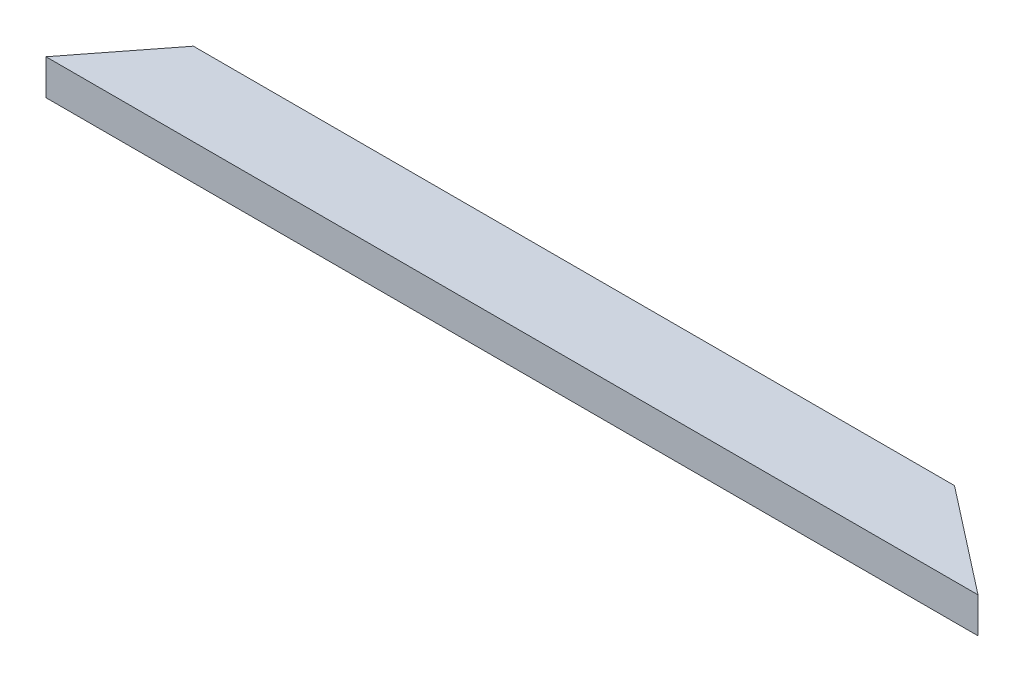
ISO-10303-21;
HEADER;
FILE_DESCRIPTION(('STEP AP214'),'2;1');
FILE_NAME('part.step','',(''),(''),'','','');
FILE_SCHEMA(('AUTOMOTIVE_DESIGN { 1 0 10303 214 1 1 1 1 }'));
ENDSEC;
DATA;
#1=APPLICATION_CONTEXT('core data for automotive mechanical design processes');
#2=APPLICATION_PROTOCOL_DEFINITION('international standard','automotive_design',2000,#1);
#3=PRODUCT_CONTEXT('',#1,'mechanical');
#4=PRODUCT('Part','Part','',(#3));
#5=PRODUCT_RELATED_PRODUCT_CATEGORY('part','',(#4));
#6=PRODUCT_DEFINITION_FORMATION('','',#4);
#7=PRODUCT_DEFINITION_CONTEXT('part definition',#1,'design');
#8=PRODUCT_DEFINITION('design','',#6,#7);
#9=PRODUCT_DEFINITION_SHAPE('','',#8);
#10=(LENGTH_UNIT() NAMED_UNIT(*) SI_UNIT(.MILLI.,.METRE.));
#11=(NAMED_UNIT(*) PLANE_ANGLE_UNIT() SI_UNIT($,.RADIAN.));
#12=(NAMED_UNIT(*) SI_UNIT($,.STERADIAN.) SOLID_ANGLE_UNIT());
#13=UNCERTAINTY_MEASURE_WITH_UNIT(LENGTH_MEASURE(1.E-05),#10,'distance_accuracy_value','');
#14=(GEOMETRIC_REPRESENTATION_CONTEXT(3) GLOBAL_UNCERTAINTY_ASSIGNED_CONTEXT((#13)) GLOBAL_UNIT_ASSIGNED_CONTEXT((#10,
#11,#12)) REPRESENTATION_CONTEXT('',''));
#15=CARTESIAN_POINT('',(0.,0.,0.));
#16=DIRECTION('',(0.,0.,1.));
#17=DIRECTION('',(1.,0.,0.));
#18=AXIS2_PLACEMENT_3D('',#15,#16,#17);
#19=CARTESIAN_POINT('',(69.2495496754036,38.1,-88.9));
#20=DIRECTION('',(0.78890000002398,0.,0.6145215943823));
#21=DIRECTION('',(0.6145215943823,0.,-0.78890000002398));
#22=AXIS2_PLACEMENT_3D('',#19,#20,#21);
#23=PLANE('',#22);
#24=DIRECTION('',(-0.6145215943823,0.,0.78890000002398));
#25=VECTOR('',#24,1.);
#26=CARTESIAN_POINT('',(69.2495496754036,0.,-88.9));
#27=LINE('',#26,#25);
#28=CARTESIAN_POINT('',(69.2495496754036,0.,-88.9));
#29=VERTEX_POINT('',#28);
#30=CARTESIAN_POINT('',(0.,0.,0.));
#31=VERTEX_POINT('',#30);
#32=EDGE_CURVE('E96',#29,#31,#27,.T.);
#33=ORIENTED_EDGE('',*,*,#32,.T.);
#34=DIRECTION('',(0.,-1.,0.));
#35=VECTOR('',#34,1.);
#36=CARTESIAN_POINT('',(0.,38.1,0.));
#37=LINE('',#36,#35);
#38=CARTESIAN_POINT('',(0.,38.1,0.));
#39=VERTEX_POINT('',#38);
#40=EDGE_CURVE('E11',#39,#31,#37,.T.);
#41=ORIENTED_EDGE('',*,*,#40,.F.);
#42=DIRECTION('',(-0.6145215943823,0.,0.78890000002398));
#43=VECTOR('',#42,1.);
#44=CARTESIAN_POINT('',(69.2495496754036,38.1,-88.9));
#45=LINE('',#44,#43);
#46=CARTESIAN_POINT('',(69.2495496754036,38.1,-88.9));
#47=VERTEX_POINT('',#46);
#48=EDGE_CURVE('E84',#47,#39,#45,.T.);
#49=ORIENTED_EDGE('',*,*,#48,.F.);
#50=DIRECTION('',(0.,-1.,0.));
#51=VECTOR('',#50,1.);
#52=CARTESIAN_POINT('',(69.2495496754036,38.1,-88.9));
#53=LINE('',#52,#51);
#54=EDGE_CURVE('E92',#47,#29,#53,.T.);
#55=ORIENTED_EDGE('',*,*,#54,.T.);
#56=EDGE_LOOP('',(#33,#41,#49,#55));
#57=FACE_BOUND('',#56,.T.);
#58=ADVANCED_FACE('F33',(#57),#23,.F.);
#59=CARTESIAN_POINT('',(0.,38.1,0.));
#60=DIRECTION('',(0.,0.,-1.));
#61=DIRECTION('',(-1.,0.,0.));
#62=AXIS2_PLACEMENT_3D('',#59,#60,#61);
#63=PLANE('',#62);
#64=DIRECTION('',(1.,0.,0.));
#65=VECTOR('',#64,1.);
#66=CARTESIAN_POINT('',(0.,0.,0.));
#67=LINE('',#66,#65);
#68=CARTESIAN_POINT('',(1000.,0.,0.));
#69=VERTEX_POINT('',#68);
#70=EDGE_CURVE('E88',#31,#69,#67,.T.);
#71=ORIENTED_EDGE('',*,*,#70,.T.);
#72=DIRECTION('',(0.,-1.,0.));
#73=VECTOR('',#72,1.);
#74=CARTESIAN_POINT('',(1000.,38.1,0.));
#75=LINE('',#74,#73);
#76=CARTESIAN_POINT('',(1000.,38.1,0.));
#77=VERTEX_POINT('',#76);
#78=EDGE_CURVE('E41',#77,#69,#75,.T.);
#79=ORIENTED_EDGE('',*,*,#78,.F.);
#80=DIRECTION('',(1.,0.,0.));
#81=VECTOR('',#80,1.);
#82=CARTESIAN_POINT('',(0.,38.1,0.));
#83=LINE('',#82,#81);
#84=EDGE_CURVE('E79',#39,#77,#83,.T.);
#85=ORIENTED_EDGE('',*,*,#84,.F.);
#86=ORIENTED_EDGE('',*,*,#40,.T.);
#87=EDGE_LOOP('',(#71,#79,#85,#86));
#88=FACE_BOUND('',#87,.T.);
#89=ADVANCED_FACE('F87',(#88),#63,.F.);
#90=CARTESIAN_POINT('',(1000.,38.1,0.));
#91=DIRECTION('',(-0.6145215943823,0.,0.78890000002398));
#92=DIRECTION('',(0.78890000002398,0.,0.6145215943823));
#93=AXIS2_PLACEMENT_3D('',#90,#91,#92);
#94=PLANE('',#93);
#95=DIRECTION('',(-0.78890000002398,0.,-0.6145215943823));
#96=VECTOR('',#95,1.);
#97=CARTESIAN_POINT('',(1000.,0.,0.));
#98=LINE('',#97,#96);
#99=CARTESIAN_POINT('',(885.873481675403,0.,-88.9));
#100=VERTEX_POINT('',#99);
#101=EDGE_CURVE('E66',#69,#100,#98,.T.);
#102=ORIENTED_EDGE('',*,*,#101,.T.);
#103=DIRECTION('',(0.,-1.,0.));
#104=VECTOR('',#103,1.);
#105=CARTESIAN_POINT('',(885.873481675403,38.1,-88.9));
#106=LINE('',#105,#104);
#107=CARTESIAN_POINT('',(885.873481675403,38.1,-88.9));
#108=VERTEX_POINT('',#107);
#109=EDGE_CURVE('E89',#108,#100,#106,.T.);
#110=ORIENTED_EDGE('',*,*,#109,.F.);
#111=DIRECTION('',(-0.78890000002398,0.,-0.6145215943823));
#112=VECTOR('',#111,1.);
#113=CARTESIAN_POINT('',(1000.,38.1,0.));
#114=LINE('',#113,#112);
#115=EDGE_CURVE('E82',#77,#108,#114,.T.);
#116=ORIENTED_EDGE('',*,*,#115,.F.);
#117=ORIENTED_EDGE('',*,*,#78,.T.);
#118=EDGE_LOOP('',(#102,#110,#116,#117));
#119=FACE_BOUND('',#118,.T.);
#120=ADVANCED_FACE('F90',(#119),#94,.F.);
#121=CARTESIAN_POINT('',(885.873481675403,38.1,-88.9));
#122=DIRECTION('',(0.,0.,1.));
#123=DIRECTION('',(1.,0.,0.));
#124=AXIS2_PLACEMENT_3D('',#121,#122,#123);
#125=PLANE('',#124);
#126=DIRECTION('',(-1.,0.,0.));
#127=VECTOR('',#126,1.);
#128=CARTESIAN_POINT('',(885.873481675403,0.,-88.9));
#129=LINE('',#128,#127);
#130=EDGE_CURVE('E72',#100,#29,#129,.T.);
#131=ORIENTED_EDGE('',*,*,#130,.T.);
#132=ORIENTED_EDGE('',*,*,#54,.F.);
#133=DIRECTION('',(-1.,0.,0.));
#134=VECTOR('',#133,1.);
#135=CARTESIAN_POINT('',(885.873481675403,38.1,-88.9));
#136=LINE('',#135,#134);
#137=EDGE_CURVE('E49',#108,#47,#136,.T.);
#138=ORIENTED_EDGE('',*,*,#137,.F.);
#139=ORIENTED_EDGE('',*,*,#109,.T.);
#140=EDGE_LOOP('',(#131,#132,#138,#139));
#141=FACE_BOUND('',#140,.T.);
#142=ADVANCED_FACE('F103',(#141),#125,.F.);
#143=CARTESIAN_POINT('',(0.,38.1,0.));
#144=DIRECTION('',(0.,-1.,0.));
#145=DIRECTION('',(0.,0.,-1.));
#146=AXIS2_PLACEMENT_3D('',#143,#144,#145);
#147=PLANE('',#146);
#148=ORIENTED_EDGE('',*,*,#48,.T.);
#149=ORIENTED_EDGE('',*,*,#84,.T.);
#150=ORIENTED_EDGE('',*,*,#115,.T.);
#151=ORIENTED_EDGE('',*,*,#137,.T.);
#152=EDGE_LOOP('',(#148,#149,#150,#151));
#153=FACE_BOUND('',#152,.T.);
#154=ADVANCED_FACE('F80',(#153),#147,.F.);
#155=CARTESIAN_POINT('',(0.,0.,0.));
#156=DIRECTION('',(0.,-1.,0.));
#157=DIRECTION('',(0.,0.,-1.));
#158=AXIS2_PLACEMENT_3D('',#155,#156,#157);
#159=PLANE('',#158);
#160=ORIENTED_EDGE('',*,*,#32,.F.);
#161=ORIENTED_EDGE('',*,*,#130,.F.);
#162=ORIENTED_EDGE('',*,*,#101,.F.);
#163=ORIENTED_EDGE('',*,*,#70,.F.);
#164=EDGE_LOOP('',(#160,#161,#162,#163));
#165=FACE_BOUND('',#164,.T.);
#166=ADVANCED_FACE('F106',(#165),#159,.T.);
#167=CLOSED_SHELL('',(#58,#89,#120,#142,#154,#166));
#168=MANIFOLD_SOLID_BREP('B2',#167);
#169=ADVANCED_BREP_SHAPE_REPRESENTATION('',(#18,#168),#14);
#170=SHAPE_DEFINITION_REPRESENTATION(#9,#169);
ENDSEC;
END-ISO-10303-21;
